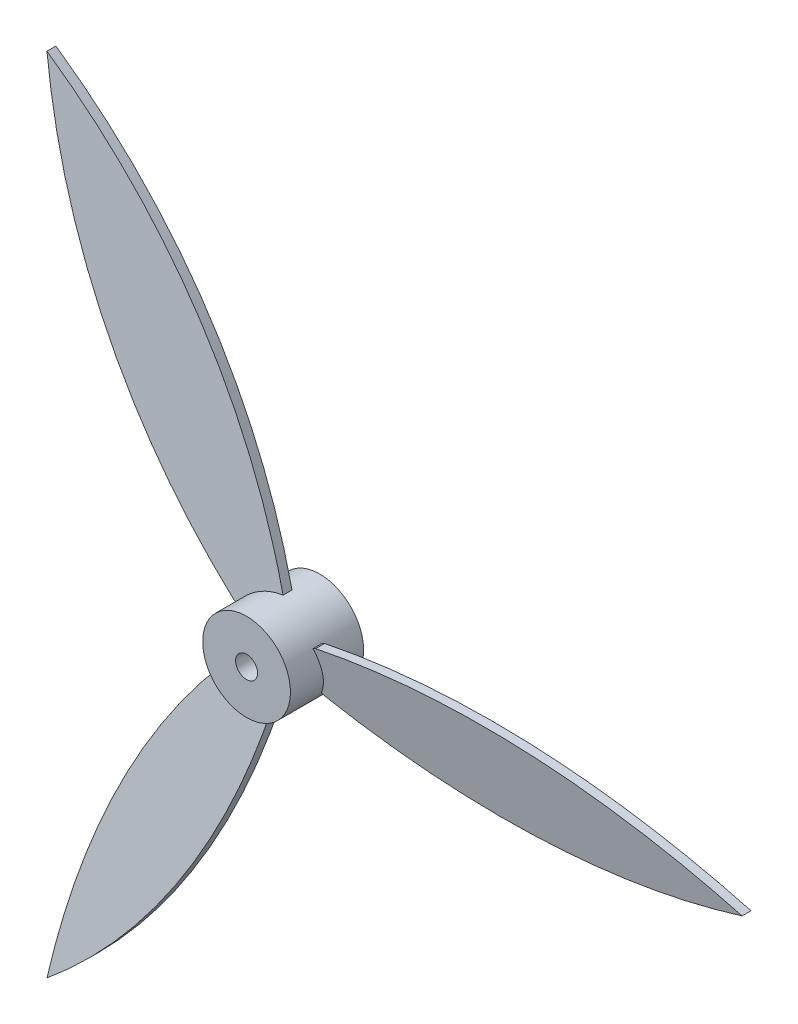
ISO-10303-21;
HEADER;
FILE_DESCRIPTION(('STEP AP214'),'2;1');
FILE_NAME('part.step','',(''),(''),'','','');
FILE_SCHEMA(('AUTOMOTIVE_DESIGN { 1 0 10303 214 1 1 1 1 }'));
ENDSEC;
DATA;
#1=APPLICATION_CONTEXT('core data for automotive mechanical design processes');
#2=APPLICATION_PROTOCOL_DEFINITION('international standard','automotive_design',2000,#1);
#3=PRODUCT_CONTEXT('',#1,'mechanical');
#4=PRODUCT('Part','Part','',(#3));
#5=PRODUCT_RELATED_PRODUCT_CATEGORY('part','',(#4));
#6=PRODUCT_DEFINITION_FORMATION('','',#4);
#7=PRODUCT_DEFINITION_CONTEXT('part definition',#1,'design');
#8=PRODUCT_DEFINITION('design','',#6,#7);
#9=PRODUCT_DEFINITION_SHAPE('','',#8);
#10=(LENGTH_UNIT() NAMED_UNIT(*) SI_UNIT(.MILLI.,.METRE.));
#11=(NAMED_UNIT(*) PLANE_ANGLE_UNIT() SI_UNIT($,.RADIAN.));
#12=(NAMED_UNIT(*) SI_UNIT($,.STERADIAN.) SOLID_ANGLE_UNIT());
#13=UNCERTAINTY_MEASURE_WITH_UNIT(LENGTH_MEASURE(1.E-05),#10,'distance_accuracy_value','');
#14=(GEOMETRIC_REPRESENTATION_CONTEXT(3) GLOBAL_UNCERTAINTY_ASSIGNED_CONTEXT((#13)) GLOBAL_UNIT_ASSIGNED_CONTEXT((#10,
#11,#12)) REPRESENTATION_CONTEXT('',''));
#15=CARTESIAN_POINT('',(0.,0.,0.));
#16=DIRECTION('',(0.,0.,1.));
#17=DIRECTION('',(1.,0.,0.));
#18=AXIS2_PLACEMENT_3D('',#15,#16,#17);
#19=CARTESIAN_POINT('',(125.,189.733037880005,0.588348405414554));
#20=DIRECTION('',(0.,0.196116135138184,-0.98058067569092));
#21=DIRECTION('',(0.,0.98058067569092,0.196116135138184));
#22=AXIS2_PLACEMENT_3D('',#19,#20,#21);
#23=PLANE('',#22);
#24=DIRECTION('',(0.861727484432137,0.497518595104998,0.0995037190209998));
#25=VECTOR('',#24,1.);
#26=CARTESIAN_POINT('',(104.024288044242,224.666690603373,7.57507895008811));
#27=LINE('',#26,#25);
#28=CARTESIAN_POINT('',(5.40472110410609,167.72865708312,-3.81252775396237));
#29=VERTEX_POINT('',#28);
#30=CARTESIAN_POINT('',(5.82433817705994,167.970923113147,-3.76407454795708));
#31=VERTEX_POINT('',#30);
#32=EDGE_CURVE('E201',#29,#31,#27,.T.);
#33=ORIENTED_EDGE('',*,*,#32,.F.);
#34=CARTESIAN_POINT('',(0.139988770109136,164.850707561088,-4.38811765836887));
#35=DIRECTION('',(0.,0.196116135138184,-0.98058067569092));
#36=DIRECTION('',(0.,0.98058067569092,0.196116135138184));
#37=AXIS2_PLACEMENT_3D('',#34,#35,#36);
#38=ELLIPSE('',#37,6.11882341631134,6.);
#39=CARTESIAN_POINT('',(5.40472110410611,161.972758039056,-4.96370756277535));
#40=VERTEX_POINT('',#39);
#41=EDGE_CURVE('E210',#40,#29,#38,.F.);
#42=ORIENTED_EDGE('',*,*,#41,.F.);
#43=DIRECTION('',(-0.861727484432144,0.497518595104987,0.0995037190209974));
#44=VECTOR('',#43,1.);
#45=CARTESIAN_POINT('',(81.8354965907787,117.845429237454,-13.7891733230956));
#46=LINE('',#45,#44);
#47=CARTESIAN_POINT('',(5.82433817706023,161.730492009029,-5.01216076878067));
#48=VERTEX_POINT('',#47);
#49=EDGE_CURVE('E379',#48,#40,#46,.T.);
#50=ORIENTED_EDGE('',*,*,#49,.F.);
#51=CARTESIAN_POINT('',(29.4903176371221,258.889750014614,14.4196908323364));
#52=DIRECTION('',(0.,0.196116135138184,-0.98058067569092));
#53=DIRECTION('',(0.,0.98058067569092,0.196116135138184));
#54=AXIS2_PLACEMENT_3D('',#51,#52,#53);
#55=ELLIPSE('',#54,101.980390271856,100.);
#56=CARTESIAN_POINT('',(63.5,164.850707561088,-4.38811765836887));
#57=VERTEX_POINT('',#56);
#58=EDGE_CURVE('E333',#57,#48,#55,.T.);
#59=ORIENTED_EDGE('',*,*,#58,.F.);
#60=CARTESIAN_POINT('',(29.4903176371221,70.8116651075614,-23.1959261490742));
#61=DIRECTION('',(0.,0.196116135138184,-0.98058067569092));
#62=DIRECTION('',(0.,0.98058067569092,0.196116135138184));
#63=AXIS2_PLACEMENT_3D('',#60,#61,#62);
#64=ELLIPSE('',#63,101.980390271856,100.);
#65=EDGE_CURVE('E330',#57,#31,#64,.F.);
#66=ORIENTED_EDGE('',*,*,#65,.T.);
#67=EDGE_LOOP('',(#33,#42,#50,#59,#66));
#68=FACE_BOUND('',#67,.T.);
#69=ADVANCED_FACE('F34',(#68),#23,.F.);
#70=CARTESIAN_POINT('',(125.,189.968377242171,-0.58834840541455));
#71=DIRECTION('',(0.,-0.196116135138184,0.98058067569092));
#72=DIRECTION('',(0.,-0.98058067569092,-0.196116135138184));
#73=AXIS2_PLACEMENT_3D('',#70,#71,#72);
#74=PLANE('',#73);
#75=DIRECTION('',(-0.861727484432137,-0.497518595104998,-0.0995037190209997));
#76=VECTOR('',#75,1.);
#77=CARTESIAN_POINT('',(104.129219856515,224.727273013435,6.36343074883834));
#78=LINE('',#77,#76);
#79=CARTESIAN_POINT('',(5.82433817705994,167.970923113147,-4.98783923121934));
#80=VERTEX_POINT('',#79);
#81=CARTESIAN_POINT('',(5.40472110410609,167.72865708312,-5.03629243722464));
#82=VERTEX_POINT('',#81);
#83=EDGE_CURVE('E190',#80,#82,#78,.T.);
#84=ORIENTED_EDGE('',*,*,#83,.F.);
#85=CARTESIAN_POINT('',(29.4903176371221,70.8116651075614,-24.4196908323364));
#86=DIRECTION('',(0.,-0.196116135138184,0.98058067569092));
#87=DIRECTION('',(0.,0.98058067569092,0.196116135138184));
#88=AXIS2_PLACEMENT_3D('',#85,#86,#87);
#89=ELLIPSE('',#88,101.980390271856,100.);
#90=CARTESIAN_POINT('',(63.5,164.850707561088,-5.61188234163113));
#91=VERTEX_POINT('',#90);
#92=EDGE_CURVE('E251',#80,#91,#89,.F.);
#93=ORIENTED_EDGE('',*,*,#92,.T.);
#94=CARTESIAN_POINT('',(29.4903176371221,258.889750014614,13.1959261490742));
#95=DIRECTION('',(0.,-0.196116135138184,0.98058067569092));
#96=DIRECTION('',(0.,0.98058067569092,0.196116135138184));
#97=AXIS2_PLACEMENT_3D('',#94,#95,#96);
#98=ELLIPSE('',#97,101.980390271856,100.);
#99=CARTESIAN_POINT('',(5.82433817706023,161.730492009029,-6.23592545204293));
#100=VERTEX_POINT('',#99);
#101=EDGE_CURVE('E254',#100,#91,#98,.T.);
#102=ORIENTED_EDGE('',*,*,#101,.F.);
#103=DIRECTION('',(0.861727484432144,-0.497518595104987,-0.0995037190209974));
#104=VECTOR('',#103,1.);
#105=CARTESIAN_POINT('',(81.7305647785056,117.906011647517,-15.0008215243454));
#106=LINE('',#105,#104);
#107=CARTESIAN_POINT('',(5.40472110410611,161.972758039056,-6.18747224603761));
#108=VERTEX_POINT('',#107);
#109=EDGE_CURVE('E217',#108,#100,#106,.T.);
#110=ORIENTED_EDGE('',*,*,#109,.F.);
#111=CARTESIAN_POINT('',(0.139988770109136,164.850707561088,-5.61188234163113));
#112=DIRECTION('',(0.,-0.196116135138184,0.98058067569092));
#113=DIRECTION('',(0.,0.98058067569092,0.196116135138184));
#114=AXIS2_PLACEMENT_3D('',#111,#112,#113);
#115=ELLIPSE('',#114,6.11882341631134,6.);
#116=EDGE_CURVE('E208',#82,#108,#115,.F.);
#117=ORIENTED_EDGE('',*,*,#116,.F.);
#118=EDGE_LOOP('',(#84,#93,#102,#110,#117));
#119=FACE_BOUND('',#118,.T.);
#120=ADVANCED_FACE('F215',(#119),#74,.F.);
#121=CARTESIAN_POINT('',(29.4903176371221,258.889750014614,-10.5883484054145));
#122=DIRECTION('',(0.,0.,1.));
#123=DIRECTION('',(1.,0.,0.));
#124=AXIS2_PLACEMENT_3D('',#121,#122,#123);
#125=CYLINDRICAL_SURFACE('',#124,100.);
#126=ORIENTED_EDGE('',*,*,#58,.T.);
#127=DIRECTION('',(0.,0.,1.));
#128=VECTOR('',#127,1.);
#129=CARTESIAN_POINT('',(5.82433817706023,161.730492009029,-10.5883484054145));
#130=LINE('',#129,#128);
#131=EDGE_CURVE('E383',#48,#100,#130,.F.);
#132=ORIENTED_EDGE('',*,*,#131,.T.);
#133=ORIENTED_EDGE('',*,*,#101,.T.);
#134=DIRECTION('',(0.,0.,1.));
#135=VECTOR('',#134,1.);
#136=CARTESIAN_POINT('',(63.5,164.850707561088,-10.5883484054145));
#137=LINE('',#136,#135);
#138=EDGE_CURVE('E327',#91,#57,#137,.T.);
#139=ORIENTED_EDGE('',*,*,#138,.T.);
#140=EDGE_LOOP('',(#126,#132,#133,#139));
#141=FACE_BOUND('',#140,.T.);
#142=ADVANCED_FACE('F582',(#141),#125,.T.);
#143=CARTESIAN_POINT('',(29.4903176371221,70.8116651075614,-10.5883484054145));
#144=DIRECTION('',(0.,0.,1.));
#145=DIRECTION('',(1.,0.,0.));
#146=AXIS2_PLACEMENT_3D('',#143,#144,#145);
#147=CYLINDRICAL_SURFACE('',#146,100.);
#148=DIRECTION('',(0.,0.,1.));
#149=VECTOR('',#148,1.);
#150=CARTESIAN_POINT('',(5.82433817705994,167.970923113147,-10.5883484054145));
#151=LINE('',#150,#149);
#152=EDGE_CURVE('E196',#31,#80,#151,.F.);
#153=ORIENTED_EDGE('',*,*,#152,.F.);
#154=ORIENTED_EDGE('',*,*,#65,.F.);
#155=ORIENTED_EDGE('',*,*,#138,.F.);
#156=ORIENTED_EDGE('',*,*,#92,.F.);
#157=EDGE_LOOP('',(#153,#154,#155,#156));
#158=FACE_BOUND('',#157,.T.);
#159=ADVANCED_FACE('F450',(#158),#147,.T.);
#160=CARTESIAN_POINT('',(-40.5374768171512,44.1599310786503,-0.58834840541455));
#161=DIRECTION('',(-0.16984155512169,0.0980580675690905,0.98058067569092));
#162=DIRECTION('',(0.985329278164293,0.,0.170664037196573));
#163=AXIS2_PLACEMENT_3D('',#160,#161,#162);
#164=PLANE('',#163);
#165=DIRECTION('',(-0.861727484432137,-0.497518595104998,-0.0995037190209997));
#166=VECTOR('',#165,1.);
#167=CARTESIAN_POINT('',(-81.3105984681764,117.663543985198,-15.0008215243455));
#168=LINE('',#167,#166);
#169=CARTESIAN_POINT('',(-4.98475479377872,161.730290376737,-6.18747224603762));
#170=VERTEX_POINT('',#169);
#171=CARTESIAN_POINT('',(-5.40437186673265,161.488024346711,-6.23592545204292));
#172=VERTEX_POINT('',#171);
#173=EDGE_CURVE('E393',#170,#172,#168,.T.);
#174=ORIENTED_EDGE('',*,*,#173,.F.);
#175=CARTESIAN_POINT('',(0.139988770109136,164.850707561088,-5.61188234163113));
#176=DIRECTION('',(-0.16984155512169,0.0980580675690905,0.98058067569092));
#177=DIRECTION('',(0.849207775608451,-0.490290337845452,0.196116135138184));
#178=AXIS2_PLACEMENT_3D('',#175,#176,#177);
#179=ELLIPSE('',#178,6.11882341631134,6.);
#180=CARTESIAN_POINT('',(0.139988770109178,158.850707561088,-5.01188234163113));
#181=VERTEX_POINT('',#180);
#182=EDGE_CURVE('E320',#181,#170,#179,.F.);
#183=ORIENTED_EDGE('',*,*,#182,.F.);
#184=CARTESIAN_POINT('',(-95.9753753757148,186.452098379589,-24.4196908323364));
#185=DIRECTION('',(-0.16984155512169,0.0980580675690905,0.98058067569092));
#186=DIRECTION('',(0.849207775608451,-0.490290337845452,0.196116135138184));
#187=AXIS2_PLACEMENT_3D('',#184,#185,#186);
#188=ELLIPSE('',#187,101.980390271856,100.);
#189=CARTESIAN_POINT('',(-31.5400168448358,109.979328251935,-5.61188234163113));
#190=VERTEX_POINT('',#189);
#191=EDGE_CURVE('E386',#181,#190,#188,.F.);
#192=ORIENTED_EDGE('',*,*,#191,.T.);
#193=CARTESIAN_POINT('',(66.9050240489205,92.4130559260643,13.1959261490742));
#194=DIRECTION('',(-0.16984155512169,0.0980580675690905,0.98058067569092));
#195=DIRECTION('',(0.849207775608451,-0.490290337845452,0.196116135138184));
#196=AXIS2_PLACEMENT_3D('',#193,#194,#195);
#197=ELLIPSE('',#196,101.980390271856,100.);
#198=EDGE_CURVE('E402',#172,#190,#197,.T.);
#199=ORIENTED_EDGE('',*,*,#198,.F.);
#200=EDGE_LOOP('',(#174,#183,#192,#199));
#201=FACE_BOUND('',#200,.T.);
#202=ADVANCED_FACE('F444',(#201),#164,.F.);
#203=CARTESIAN_POINT('',(-40.7412866832972,44.2776007597332,0.588348405414554));
#204=DIRECTION('',(0.16984155512169,-0.0980580675690905,-0.98058067569092));
#205=DIRECTION('',(-0.985329278164293,0.,-0.170664037196573));
#206=AXIS2_PLACEMENT_3D('',#203,#204,#205);
#207=PLANE('',#206);
#208=DIRECTION('',(0.861727484432137,0.497518595104999,0.0995037190209998));
#209=VECTOR('',#208,1.);
#210=CARTESIAN_POINT('',(-81.4155302804496,117.602961575136,-13.7891733230957));
#211=LINE('',#210,#209);
#212=CARTESIAN_POINT('',(-5.40437186673265,161.488024346711,-5.01216076878066));
#213=VERTEX_POINT('',#212);
#214=CARTESIAN_POINT('',(-4.98475479377872,161.730290376737,-4.96370756277536));
#215=VERTEX_POINT('',#214);
#216=EDGE_CURVE('E395',#213,#215,#211,.T.);
#217=ORIENTED_EDGE('',*,*,#216,.F.);
#218=CARTESIAN_POINT('',(66.9050240489205,92.4130559260643,14.4196908323364));
#219=DIRECTION('',(0.16984155512169,-0.0980580675690905,-0.98058067569092));
#220=DIRECTION('',(0.849207775608451,-0.490290337845452,0.196116135138184));
#221=AXIS2_PLACEMENT_3D('',#218,#219,#220);
#222=ELLIPSE('',#221,101.980390271856,100.);
#223=CARTESIAN_POINT('',(-31.5400168448358,109.979328251935,-4.38811765836886));
#224=VERTEX_POINT('',#223);
#225=EDGE_CURVE('E405',#224,#213,#222,.T.);
#226=ORIENTED_EDGE('',*,*,#225,.F.);
#227=CARTESIAN_POINT('',(-95.9753753757148,186.452098379589,-23.1959261490742));
#228=DIRECTION('',(0.16984155512169,-0.0980580675690905,-0.98058067569092));
#229=DIRECTION('',(0.849207775608451,-0.490290337845452,0.196116135138184));
#230=AXIS2_PLACEMENT_3D('',#227,#228,#229);
#231=ELLIPSE('',#230,101.980390271856,100.);
#232=CARTESIAN_POINT('',(0.139988770109178,158.850707561088,-3.78811765836886));
#233=VERTEX_POINT('',#232);
#234=EDGE_CURVE('E11',#224,#233,#231,.F.);
#235=ORIENTED_EDGE('',*,*,#234,.T.);
#236=CARTESIAN_POINT('',(0.139988770109136,164.850707561088,-4.38811765836886));
#237=DIRECTION('',(0.16984155512169,-0.0980580675690905,-0.98058067569092));
#238=DIRECTION('',(0.849207775608451,-0.490290337845452,0.196116135138184));
#239=AXIS2_PLACEMENT_3D('',#236,#237,#238);
#240=ELLIPSE('',#239,6.11882341631134,6.);
#241=EDGE_CURVE('E348',#215,#233,#240,.F.);
#242=ORIENTED_EDGE('',*,*,#241,.F.);
#243=EDGE_LOOP('',(#217,#226,#235,#242));
#244=FACE_BOUND('',#243,.T.);
#245=ADVANCED_FACE('F449',(#244),#207,.F.);
#246=CARTESIAN_POINT('',(-84.0425568725207,260.423814362442,-0.58834840541455));
#247=DIRECTION('',(0.169841555121689,0.0980580675690928,0.98058067569092));
#248=DIRECTION('',(0.985329278164293,0.,-0.170664037196572));
#249=AXIS2_PLACEMENT_3D('',#246,#247,#248);
#250=PLANE('',#249);
#251=CARTESIAN_POINT('',(-95.9753753757145,143.249316742585,13.1959261490742));
#252=DIRECTION('',(0.169841555121689,0.0980580675690928,0.98058067569092));
#253=DIRECTION('',(-0.849207775608445,-0.490290337845464,0.196116135138184));
#254=AXIS2_PLACEMENT_3D('',#251,#252,#253);
#255=ELLIPSE('',#254,101.980390271856,100.);
#256=CARTESIAN_POINT('',(0.139988770109095,170.850707561088,-6.21188234163113));
#257=VERTEX_POINT('',#256);
#258=CARTESIAN_POINT('',(-31.5400168448366,219.722086870241,-5.61188234163113));
#259=VERTEX_POINT('',#258);
#260=EDGE_CURVE('E397',#257,#259,#255,.T.);
#261=ORIENTED_EDGE('',*,*,#260,.F.);
#262=CARTESIAN_POINT('',(0.139988770109136,164.850707561088,-5.61188234163113));
#263=DIRECTION('',(0.169841555121689,0.0980580675690928,0.98058067569092));
#264=DIRECTION('',(-0.849207775608445,-0.490290337845464,0.196116135138184));
#265=AXIS2_PLACEMENT_3D('',#262,#263,#264);
#266=ELLIPSE('',#265,6.11882341631134,6.);
#267=CARTESIAN_POINT('',(-4.98475479377876,167.971124745438,-5.03629243722463));
#268=VERTEX_POINT('',#267);
#269=EDGE_CURVE('E303',#268,#257,#266,.F.);
#270=ORIENTED_EDGE('',*,*,#269,.F.);
#271=DIRECTION('',(0.861727484432144,-0.497518595104987,-0.0995037190209997));
#272=VECTOR('',#271,1.);
#273=CARTESIAN_POINT('',(-103.709253546189,224.969740675752,6.36343074883834));
#274=LINE('',#273,#272);
#275=CARTESIAN_POINT('',(-5.40437186673261,168.213390775465,-4.98783923121934));
#276=VERTEX_POINT('',#275);
#277=EDGE_CURVE('E400',#276,#268,#274,.T.);
#278=ORIENTED_EDGE('',*,*,#277,.F.);
#279=CARTESIAN_POINT('',(66.9050240489195,237.288359196112,-24.4196908323364));
#280=DIRECTION('',(0.169841555121689,0.0980580675690928,0.98058067569092));
#281=DIRECTION('',(-0.849207775608445,-0.490290337845464,0.196116135138184));
#282=AXIS2_PLACEMENT_3D('',#279,#280,#281);
#283=ELLIPSE('',#282,101.980390271856,100.);
#284=EDGE_CURVE('E389',#276,#259,#283,.F.);
#285=ORIENTED_EDGE('',*,*,#284,.T.);
#286=EDGE_LOOP('',(#261,#270,#278,#285));
#287=FACE_BOUND('',#286,.T.);
#288=ADVANCED_FACE('F434',(#287),#250,.F.);
#289=CARTESIAN_POINT('',(-83.8387470063747,260.541484043525,0.588348405414554));
#290=DIRECTION('',(-0.169841555121689,-0.0980580675690929,-0.98058067569092));
#291=DIRECTION('',(-0.985329278164293,0.,0.170664037196572));
#292=AXIS2_PLACEMENT_3D('',#289,#290,#291);
#293=PLANE('',#292);
#294=CARTESIAN_POINT('',(-95.9753753757145,143.249316742585,14.4196908323364));
#295=DIRECTION('',(-0.169841555121689,-0.0980580675690929,-0.98058067569092));
#296=DIRECTION('',(-0.849207775608444,-0.490290337845464,0.196116135138184));
#297=AXIS2_PLACEMENT_3D('',#294,#295,#296);
#298=ELLIPSE('',#297,101.980390271856,100.);
#299=CARTESIAN_POINT('',(-31.5400168448366,219.722086870241,-4.38811765836886));
#300=VERTEX_POINT('',#299);
#301=CARTESIAN_POINT('',(0.139988770109095,170.850707561088,-4.98811765836886));
#302=VERTEX_POINT('',#301);
#303=EDGE_CURVE('E43',#300,#302,#298,.T.);
#304=ORIENTED_EDGE('',*,*,#303,.F.);
#305=CARTESIAN_POINT('',(66.9050240489195,237.288359196112,-23.1959261490742));
#306=DIRECTION('',(-0.169841555121689,-0.0980580675690929,-0.98058067569092));
#307=DIRECTION('',(-0.849207775608444,-0.490290337845464,0.196116135138184));
#308=AXIS2_PLACEMENT_3D('',#305,#306,#307);
#309=ELLIPSE('',#308,101.980390271856,100.);
#310=CARTESIAN_POINT('',(-5.4043718667326,168.213390775465,-3.76407454795708));
#311=VERTEX_POINT('',#310);
#312=EDGE_CURVE('E279',#300,#311,#309,.F.);
#313=ORIENTED_EDGE('',*,*,#312,.T.);
#314=DIRECTION('',(-0.861727484432144,0.497518595104987,0.0995037190209997));
#315=VECTOR('',#314,1.);
#316=CARTESIAN_POINT('',(-103.604321733915,224.909158265689,7.57507895008811));
#317=LINE('',#316,#315);
#318=CARTESIAN_POINT('',(-4.98475479377876,167.971124745438,-3.81252775396237));
#319=VERTEX_POINT('',#318);
#320=EDGE_CURVE('E277',#319,#311,#317,.T.);
#321=ORIENTED_EDGE('',*,*,#320,.F.);
#322=CARTESIAN_POINT('',(0.139988770109136,164.850707561088,-4.38811765836886));
#323=DIRECTION('',(-0.169841555121689,-0.0980580675690929,-0.98058067569092));
#324=DIRECTION('',(-0.849207775608444,-0.490290337845464,0.196116135138184));
#325=AXIS2_PLACEMENT_3D('',#322,#323,#324);
#326=ELLIPSE('',#325,6.11882341631134,6.);
#327=EDGE_CURVE('E301',#302,#319,#326,.F.);
#328=ORIENTED_EDGE('',*,*,#327,.F.);
#329=EDGE_LOOP('',(#304,#313,#321,#328));
#330=FACE_BOUND('',#329,.T.);
#331=ADVANCED_FACE('F307',(#330),#293,.F.);
#332=CARTESIAN_POINT('',(0.139988770109136,164.850707561088,-10.));
#333=DIRECTION('',(0.,0.,1.));
#334=DIRECTION('',(1.,0.,0.));
#335=AXIS2_PLACEMENT_3D('',#332,#333,#334);
#336=CYLINDRICAL_SURFACE('',#335,1.49999999999999);
#337=CARTESIAN_POINT('',(0.139988770109136,164.850707561088,0.));
#338=DIRECTION('',(0.,0.,1.));
#339=DIRECTION('',(1.,0.,0.));
#340=AXIS2_PLACEMENT_3D('',#337,#338,#339);
#341=CIRCLE('',#340,1.49999999999999);
#342=CARTESIAN_POINT('',(1.63998877010913,164.850707561088,0.));
#343=VERTEX_POINT('',#342);
#344=EDGE_CURVE('E220',#343,#343,#341,.T.);
#345=ORIENTED_EDGE('',*,*,#344,.T.);
#346=EDGE_LOOP('',(#345));
#347=FACE_BOUND('',#346,.T.);
#348=CARTESIAN_POINT('',(0.139988770109136,164.850707561088,-4.38811765836886));
#349=DIRECTION('',(-0.169841555121689,-0.0980580675690929,-0.98058067569092));
#350=DIRECTION('',(-0.849207775608444,-0.490290337845464,0.196116135138184));
#351=AXIS2_PLACEMENT_3D('',#348,#349,#350);
#352=ELLIPSE('',#351,1.52970585407783,1.49999999999999);
#353=CARTESIAN_POINT('',(0.,166.344160989971,-4.51321623502538));
#354=VERTEX_POINT('',#353);
#355=CARTESIAN_POINT('',(-1.08338545361822,163.982747015487,-4.0894269725922));
#356=VERTEX_POINT('',#355);
#357=EDGE_CURVE('E309',#354,#356,#352,.F.);
#358=ORIENTED_EDGE('',*,*,#357,.F.);
#359=DIRECTION('',(0.,0.,1.));
#360=VECTOR('',#359,1.);
#361=CARTESIAN_POINT('',(0.,166.344160989971,-10.));
#362=LINE('',#361,#360);
#363=CARTESIAN_POINT('',(0.,166.344160989971,-4.08942697259221));
#364=VERTEX_POINT('',#363);
#365=EDGE_CURVE('E237',#354,#364,#362,.T.);
#366=ORIENTED_EDGE('',*,*,#365,.T.);
#367=CARTESIAN_POINT('',(0.139988770109136,164.850707561088,-4.38811765836887));
#368=DIRECTION('',(0.,0.196116135138184,-0.98058067569092));
#369=DIRECTION('',(0.,0.98058067569092,0.196116135138184));
#370=AXIS2_PLACEMENT_3D('',#367,#368,#369);
#371=ELLIPSE('',#370,1.52970585407783,1.49999999999999);
#372=CARTESIAN_POINT('',(1.50335176394563,164.225214677805,-4.51321623502538));
#373=VERTEX_POINT('',#372);
#374=EDGE_CURVE('E245',#373,#364,#371,.F.);
#375=ORIENTED_EDGE('',*,*,#374,.F.);
#376=DIRECTION('',(0.,0.,1.));
#377=VECTOR('',#376,1.);
#378=CARTESIAN_POINT('',(1.50335176394563,164.225214677805,-10.));
#379=LINE('',#378,#377);
#380=CARTESIAN_POINT('',(1.50335176394563,164.225214677805,-4.0894269725922));
#381=VERTEX_POINT('',#380);
#382=EDGE_CURVE('E354',#373,#381,#379,.T.);
#383=ORIENTED_EDGE('',*,*,#382,.T.);
#384=CARTESIAN_POINT('',(0.139988770109136,164.850707561088,-4.38811765836886));
#385=DIRECTION('',(0.16984155512169,-0.0980580675690905,-0.98058067569092));
#386=DIRECTION('',(0.849207775608451,-0.490290337845452,0.196116135138184));
#387=AXIS2_PLACEMENT_3D('',#384,#385,#386);
#388=ELLIPSE('',#387,1.52970585407783,1.49999999999999);
#389=CARTESIAN_POINT('',(-1.08338545361819,163.982747015487,-4.51321623502538));
#390=VERTEX_POINT('',#389);
#391=EDGE_CURVE('E350',#390,#381,#388,.F.);
#392=ORIENTED_EDGE('',*,*,#391,.F.);
#393=DIRECTION('',(0.,0.,1.));
#394=VECTOR('',#393,1.);
#395=CARTESIAN_POINT('',(-1.08338545361822,163.982747015487,-10.));
#396=LINE('',#395,#394);
#397=EDGE_CURVE('E272',#390,#356,#396,.T.);
#398=ORIENTED_EDGE('',*,*,#397,.T.);
#399=EDGE_LOOP('',(#358,#366,#375,#383,#392,#398));
#400=FACE_BOUND('',#399,.T.);
#401=ADVANCED_FACE('F433',(#347,#400),#336,.F.);
#402=CARTESIAN_POINT('',(0.,0.,0.));
#403=DIRECTION('',(-1.,0.,0.));
#404=DIRECTION('',(0.,0.,1.));
#405=AXIS2_PLACEMENT_3D('',#402,#403,#404);
#406=PLANE('',#405);
#407=ORIENTED_EDGE('',*,*,#365,.F.);
#408=DIRECTION('',(0.,-0.995037190209989,0.0995037190209997));
#409=VECTOR('',#408,1.);
#410=CARTESIAN_POINT('',(0.,1.20011879841307,12.0011879841306));
#411=LINE('',#410,#409);
#412=CARTESIAN_POINT('',(0.,164.931530115194,-4.37195314754766));
#413=VERTEX_POINT('',#412);
#414=EDGE_CURVE('E314',#354,#413,#411,.T.);
#415=ORIENTED_EDGE('',*,*,#414,.T.);
#416=DIRECTION('',(0.,-0.98058067569092,-0.196116135138184));
#417=VECTOR('',#416,1.);
#418=CARTESIAN_POINT('',(0.,189.733037880005,0.588348405414554));
#419=LINE('',#418,#417);
#420=EDGE_CURVE('E222',#364,#413,#419,.T.);
#421=ORIENTED_EDGE('',*,*,#420,.F.);
#422=EDGE_LOOP('',(#407,#415,#421));
#423=FACE_BOUND('',#422,.T.);
#424=ADVANCED_FACE('F345',(#423),#406,.T.);
#425=DIRECTION('',(0.,0.,1.));
#426=VECTOR('',#425,1.);
#427=CARTESIAN_POINT('',(0.,163.357254132205,-10.));
#428=LINE('',#427,#426);
#429=CARTESIAN_POINT('',(0.,163.357254132205,-5.48678376497461));
#430=VERTEX_POINT('',#429);
#431=CARTESIAN_POINT('',(0.,163.357254132205,-5.91057302740779));
#432=VERTEX_POINT('',#431);
#433=EDGE_CURVE('E249',#430,#432,#428,.F.);
#434=ORIENTED_EDGE('',*,*,#433,.F.);
#435=DIRECTION('',(0.,0.995037190209989,-0.0995037190209973));
#436=VECTOR('',#435,1.);
#437=CARTESIAN_POINT('',(0.,1.07415263844014,10.7415263844016));
#438=LINE('',#437,#436);
#439=CARTESIAN_POINT('',(0.,164.769885006982,-5.62804685245233));
#440=VERTEX_POINT('',#439);
#441=EDGE_CURVE('E308',#430,#440,#438,.T.);
#442=ORIENTED_EDGE('',*,*,#441,.T.);
#443=DIRECTION('',(0.,0.98058067569092,0.196116135138184));
#444=VECTOR('',#443,1.);
#445=CARTESIAN_POINT('',(0.,189.968377242171,-0.58834840541455));
#446=LINE('',#445,#444);
#447=EDGE_CURVE('E218',#432,#440,#446,.T.);
#448=ORIENTED_EDGE('',*,*,#447,.F.);
#449=EDGE_LOOP('',(#434,#442,#448));
#450=FACE_BOUND('',#449,.T.);
#451=ADVANCED_FACE('F598',(#450),#406,.T.);
#452=DIRECTION('',(-0.86172748443214,0.497518595104993,0.0995037190209985));
#453=VECTOR('',#452,1.);
#454=CARTESIAN_POINT('',(81.7634231645831,117.725395741257,-13.8131800223351));
#455=LINE('',#454,#453);
#456=CARTESIAN_POINT('',(0.139988770109151,164.850707561088,-4.38811765836887));
#457=VERTEX_POINT('',#456);
#458=EDGE_CURVE('E261',#457,#413,#455,.T.);
#459=ORIENTED_EDGE('',*,*,#458,.F.);
#460=DIRECTION('',(-0.861727484432137,-0.497518595104999,-0.0995037190209998));
#461=VECTOR('',#460,1.);
#462=CARTESIAN_POINT('',(103.952214618047,224.78672409957,7.59908564932752));
#463=LINE('',#462,#461);
#464=CARTESIAN_POINT('',(0.279977540218314,164.931530115194,-4.37195314754766));
#465=VERTEX_POINT('',#464);
#466=EDGE_CURVE('E259',#465,#457,#463,.T.);
#467=ORIENTED_EDGE('',*,*,#466,.F.);
#468=DIRECTION('',(0.861727484432144,-0.497518595104987,-0.0995037190209974));
#469=VECTOR('',#468,1.);
#470=CARTESIAN_POINT('',(81.8354965907787,117.845429237454,-13.7891733230956));
#471=LINE('',#470,#469);
#472=EDGE_CURVE('E256',#465,#373,#471,.T.);
#473=ORIENTED_EDGE('',*,*,#472,.T.);
#474=ORIENTED_EDGE('',*,*,#374,.T.);
#475=ORIENTED_EDGE('',*,*,#420,.T.);
#476=EDGE_LOOP('',(#459,#467,#473,#474,#475));
#477=FACE_BOUND('',#476,.T.);
#478=ADVANCED_FACE('F339',(#477),#23,.F.);
#479=CARTESIAN_POINT('',(0.139988770109136,164.850707561088,-10.));
#480=DIRECTION('',(0.,0.,1.));
#481=DIRECTION('',(1.,0.,0.));
#482=AXIS2_PLACEMENT_3D('',#479,#480,#481);
#483=CYLINDRICAL_SURFACE('',#482,6.);
#484=ORIENTED_EDGE('',*,*,#41,.T.);
#485=DIRECTION('',(0.,0.,1.));
#486=VECTOR('',#485,1.);
#487=CARTESIAN_POINT('',(5.40472110410609,167.72865708312,-10.5883484054145));
#488=LINE('',#487,#486);
#489=EDGE_CURVE('E193',#82,#29,#488,.T.);
#490=ORIENTED_EDGE('',*,*,#489,.F.);
#491=ORIENTED_EDGE('',*,*,#116,.T.);
#492=DIRECTION('',(0.,0.,1.));
#493=VECTOR('',#492,1.);
#494=CARTESIAN_POINT('',(5.40472110410611,161.972758039056,-10.5883484054145));
#495=LINE('',#494,#493);
#496=EDGE_CURVE('E421',#108,#40,#495,.T.);
#497=ORIENTED_EDGE('',*,*,#496,.T.);
#498=EDGE_LOOP('',(#484,#490,#491,#497));
#499=FACE_BOUND('',#498,.T.);
#500=DIRECTION('',(0.,0.,1.));
#501=VECTOR('',#500,1.);
#502=CARTESIAN_POINT('',(-4.98475479377872,161.730290376737,-10.5883484054145));
#503=LINE('',#502,#501);
#504=EDGE_CURVE('E211',#170,#215,#503,.T.);
#505=ORIENTED_EDGE('',*,*,#504,.T.);
#506=ORIENTED_EDGE('',*,*,#241,.T.);
#507=DIRECTION('',(0.,0.,1.));
#508=VECTOR('',#507,1.);
#509=CARTESIAN_POINT('',(0.139988770109178,158.850707561088,-10.5883484054145));
#510=LINE('',#509,#508);
#511=EDGE_CURVE('E423',#181,#233,#510,.T.);
#512=ORIENTED_EDGE('',*,*,#511,.F.);
#513=ORIENTED_EDGE('',*,*,#182,.T.);
#514=EDGE_LOOP('',(#505,#506,#512,#513));
#515=FACE_BOUND('',#514,.T.);
#516=CARTESIAN_POINT('',(0.139988770109136,164.850707561088,-10.));
#517=DIRECTION('',(0.,0.,1.));
#518=DIRECTION('',(1.,0.,0.));
#519=AXIS2_PLACEMENT_3D('',#516,#517,#518);
#520=CIRCLE('',#519,6.);
#521=CARTESIAN_POINT('',(6.13998877010914,164.850707561088,-10.));
#522=VERTEX_POINT('',#521);
#523=EDGE_CURVE('E233',#522,#522,#520,.T.);
#524=ORIENTED_EDGE('',*,*,#523,.T.);
#525=EDGE_LOOP('',(#524));
#526=FACE_BOUND('',#525,.T.);
#527=DIRECTION('',(0.,0.,1.));
#528=VECTOR('',#527,1.);
#529=CARTESIAN_POINT('',(0.139988770109095,170.850707561088,-10.5883484054145));
#530=LINE('',#529,#528);
#531=EDGE_CURVE('E212',#257,#302,#530,.T.);
#532=ORIENTED_EDGE('',*,*,#531,.T.);
#533=ORIENTED_EDGE('',*,*,#327,.T.);
#534=DIRECTION('',(0.,0.,1.));
#535=VECTOR('',#534,1.);
#536=CARTESIAN_POINT('',(-4.98475479377874,167.971124745438,-10.5883484054145));
#537=LINE('',#536,#535);
#538=EDGE_CURVE('E419',#268,#319,#537,.T.);
#539=ORIENTED_EDGE('',*,*,#538,.F.);
#540=ORIENTED_EDGE('',*,*,#269,.T.);
#541=EDGE_LOOP('',(#532,#533,#539,#540));
#542=FACE_BOUND('',#541,.T.);
#543=CARTESIAN_POINT('',(0.139988770109136,164.850707561088,0.));
#544=DIRECTION('',(0.,0.,1.));
#545=DIRECTION('',(1.,0.,0.));
#546=AXIS2_PLACEMENT_3D('',#543,#544,#545);
#547=CIRCLE('',#546,6.);
#548=CARTESIAN_POINT('',(6.13998877010914,164.850707561088,0.));
#549=VERTEX_POINT('',#548);
#550=EDGE_CURVE('E230',#549,#549,#547,.T.);
#551=ORIENTED_EDGE('',*,*,#550,.F.);
#552=EDGE_LOOP('',(#551));
#553=FACE_BOUND('',#552,.T.);
#554=ADVANCED_FACE('F36',(#499,#515,#526,#542,#553),#483,.T.);
#555=CARTESIAN_POINT('',(0.139988770109136,164.850707561088,-10.));
#556=DIRECTION('',(0.,0.,1.));
#557=DIRECTION('',(1.,0.,0.));
#558=AXIS2_PLACEMENT_3D('',#555,#556,#557);
#559=PLANE('',#558);
#560=CARTESIAN_POINT('',(0.139988770109136,164.850707561088,-10.));
#561=DIRECTION('',(0.,0.,1.));
#562=DIRECTION('',(1.,0.,0.));
#563=AXIS2_PLACEMENT_3D('',#560,#561,#562);
#564=CIRCLE('',#563,1.49999999999999);
#565=CARTESIAN_POINT('',(1.63998877010913,164.850707561088,-10.));
#566=VERTEX_POINT('',#565);
#567=EDGE_CURVE('E226',#566,#566,#564,.T.);
#568=ORIENTED_EDGE('',*,*,#567,.T.);
#569=EDGE_LOOP('',(#568));
#570=FACE_BOUND('',#569,.T.);
#571=ORIENTED_EDGE('',*,*,#523,.F.);
#572=EDGE_LOOP('',(#571));
#573=FACE_BOUND('',#572,.T.);
#574=ADVANCED_FACE('F536',(#570,#573),#559,.F.);
#575=CARTESIAN_POINT('',(0.139988770109136,164.850707561088,0.));
#576=DIRECTION('',(0.,0.,1.));
#577=DIRECTION('',(1.,0.,0.));
#578=AXIS2_PLACEMENT_3D('',#575,#576,#577);
#579=PLANE('',#578);
#580=ORIENTED_EDGE('',*,*,#344,.F.);
#581=EDGE_LOOP('',(#580));
#582=FACE_BOUND('',#581,.T.);
#583=ORIENTED_EDGE('',*,*,#550,.T.);
#584=EDGE_LOOP('',(#583));
#585=FACE_BOUND('',#584,.T.);
#586=ADVANCED_FACE('F546',(#582,#585),#579,.T.);
#587=CARTESIAN_POINT('',(0.139988770109136,164.850707561088,-5.61188234163113));
#588=DIRECTION('',(0.,-0.196116135138184,0.98058067569092));
#589=DIRECTION('',(0.,0.98058067569092,0.196116135138184));
#590=AXIS2_PLACEMENT_3D('',#587,#588,#589);
#591=ELLIPSE('',#590,1.52970585407783,1.49999999999999);
#592=CARTESIAN_POINT('',(1.50335176394567,165.476200444371,-5.4867837649746));
#593=VERTEX_POINT('',#592);
#594=EDGE_CURVE('E242',#593,#432,#591,.F.);
#595=ORIENTED_EDGE('',*,*,#594,.F.);
#596=DIRECTION('',(0.,0.,1.));
#597=VECTOR('',#596,1.);
#598=CARTESIAN_POINT('',(1.50335176394562,165.476200444371,-10.));
#599=LINE('',#598,#597);
#600=CARTESIAN_POINT('',(1.50335176394562,165.476200444371,-5.91057302740779));
#601=VERTEX_POINT('',#600);
#602=EDGE_CURVE('E58',#593,#601,#599,.F.);
#603=ORIENTED_EDGE('',*,*,#602,.T.);
#604=CARTESIAN_POINT('',(0.139988770109136,164.850707561088,-5.61188234163113));
#605=DIRECTION('',(0.169841555121689,0.0980580675690928,0.98058067569092));
#606=DIRECTION('',(-0.849207775608445,-0.490290337845464,0.196116135138184));
#607=AXIS2_PLACEMENT_3D('',#604,#605,#606);
#608=ELLIPSE('',#607,1.52970585407783,1.49999999999999);
#609=CARTESIAN_POINT('',(-1.08338545361822,165.718668106689,-5.48678376497461));
#610=VERTEX_POINT('',#609);
#611=EDGE_CURVE('E324',#610,#601,#608,.F.);
#612=ORIENTED_EDGE('',*,*,#611,.F.);
#613=DIRECTION('',(0.,0.,1.));
#614=VECTOR('',#613,1.);
#615=CARTESIAN_POINT('',(-1.08338545361822,165.718668106689,-10.));
#616=LINE('',#615,#614);
#617=CARTESIAN_POINT('',(-1.08338545361822,165.718668106689,-5.91057302740779));
#618=VERTEX_POINT('',#617);
#619=EDGE_CURVE('E275',#610,#618,#616,.F.);
#620=ORIENTED_EDGE('',*,*,#619,.T.);
#621=CARTESIAN_POINT('',(0.139988770109136,164.850707561088,-5.61188234163113));
#622=DIRECTION('',(-0.16984155512169,0.0980580675690905,0.98058067569092));
#623=DIRECTION('',(0.849207775608451,-0.490290337845452,0.196116135138184));
#624=AXIS2_PLACEMENT_3D('',#621,#622,#623);
#625=ELLIPSE('',#624,1.52970585407783,1.49999999999999);
#626=EDGE_CURVE('E312',#430,#618,#625,.F.);
#627=ORIENTED_EDGE('',*,*,#626,.F.);
#628=ORIENTED_EDGE('',*,*,#433,.T.);
#629=EDGE_LOOP('',(#595,#603,#612,#620,#627,#628));
#630=FACE_BOUND('',#629,.T.);
#631=ORIENTED_EDGE('',*,*,#567,.F.);
#632=EDGE_LOOP('',(#631));
#633=FACE_BOUND('',#632,.T.);
#634=ADVANCED_FACE('F556',(#630,#633),#336,.F.);
#635=DIRECTION('',(-0.86172748443214,0.497518595104992,0.0995037190209985));
#636=VECTOR('',#635,1.);
#637=CARTESIAN_POINT('',(81.6584913523099,117.785978151319,-15.0248282235848));
#638=LINE('',#637,#636);
#639=CARTESIAN_POINT('',(0.279977540218235,164.769885006982,-5.62804685245233));
#640=VERTEX_POINT('',#639);
#641=CARTESIAN_POINT('',(0.139988770109148,164.850707561088,-5.61188234163113));
#642=VERTEX_POINT('',#641);
#643=EDGE_CURVE('E266',#640,#642,#638,.T.);
#644=ORIENTED_EDGE('',*,*,#643,.F.);
#645=DIRECTION('',(0.861727484432137,0.497518595104999,0.0995037190209997));
#646=VECTOR('',#645,1.);
#647=CARTESIAN_POINT('',(104.129219856515,224.727273013435,6.36343074883834));
#648=LINE('',#647,#646);
#649=EDGE_CURVE('E269',#640,#593,#648,.T.);
#650=ORIENTED_EDGE('',*,*,#649,.T.);
#651=ORIENTED_EDGE('',*,*,#594,.T.);
#652=ORIENTED_EDGE('',*,*,#447,.T.);
#653=DIRECTION('',(-0.861727484432137,-0.497518595104999,-0.0995037190209997));
#654=VECTOR('',#653,1.);
#655=CARTESIAN_POINT('',(104.05714643032,224.847306509632,6.38743744807775));
#656=LINE('',#655,#654);
#657=EDGE_CURVE('E263',#642,#440,#656,.T.);
#658=ORIENTED_EDGE('',*,*,#657,.F.);
#659=EDGE_LOOP('',(#644,#650,#651,#652,#658));
#660=FACE_BOUND('',#659,.T.);
#661=ADVANCED_FACE('F565',(#660),#74,.F.);
#662=CARTESIAN_POINT('',(-142.554917424579,247.39729517279,0.));
#663=DIRECTION('',(0.499999999999992,0.866025403784443,0.));
#664=DIRECTION('',(0.,0.,1.));
#665=AXIS2_PLACEMENT_3D('',#662,#663,#664);
#666=PLANE('',#665);
#667=ORIENTED_EDGE('',*,*,#382,.F.);
#668=ORIENTED_EDGE('',*,*,#472,.F.);
#669=DIRECTION('',(-0.849207775608451,0.490290337845452,-0.196116135138184));
#670=VECTOR('',#669,1.);
#671=CARTESIAN_POINT('',(21.7587133167018,152.530776232789,0.588348405414554));
#672=LINE('',#671,#670);
#673=EDGE_CURVE('E376',#381,#465,#672,.T.);
#674=ORIENTED_EDGE('',*,*,#673,.F.);
#675=EDGE_LOOP('',(#667,#668,#674));
#676=FACE_BOUND('',#675,.T.);
#677=ADVANCED_FACE('F623',(#676),#666,.T.);
#678=DIRECTION('',(0.861727484432137,0.497518595104999,0.0995037190209998));
#679=VECTOR('',#678,1.);
#680=CARTESIAN_POINT('',(141.93555036792,246.554768111267,12.0011879841306));
#681=LINE('',#680,#679);
#682=CARTESIAN_POINT('',(0.139988770108748,164.689062452876,-4.37195314754763));
#683=VERTEX_POINT('',#682);
#684=EDGE_CURVE('E357',#390,#683,#681,.T.);
#685=ORIENTED_EDGE('',*,*,#684,.F.);
#686=ORIENTED_EDGE('',*,*,#391,.T.);
#687=ORIENTED_EDGE('',*,*,#673,.T.);
#688=ORIENTED_EDGE('',*,*,#466,.T.);
#689=DIRECTION('',(0.,-0.995037190209989,0.0995037190209985));
#690=VECTOR('',#689,1.);
#691=CARTESIAN_POINT('',(0.139988770108498,259.10133120075,-13.8131800223351));
#692=LINE('',#691,#690);
#693=EDGE_CURVE('E365',#457,#683,#692,.T.);
#694=ORIENTED_EDGE('',*,*,#693,.T.);
#695=EDGE_LOOP('',(#685,#686,#687,#688,#694));
#696=FACE_BOUND('',#695,.T.);
#697=ADVANCED_FACE('F465',(#696),#207,.F.);
#698=ORIENTED_EDGE('',*,*,#414,.F.);
#699=ORIENTED_EDGE('',*,*,#357,.T.);
#700=DIRECTION('',(0.849207775608445,0.490290337845464,-0.196116135138184));
#701=VECTOR('',#700,1.);
#702=CARTESIAN_POINT('',(-21.3387470063742,152.28830857047,0.588348405414554));
#703=LINE('',#702,#701);
#704=EDGE_CURVE('E363',#356,#683,#703,.T.);
#705=ORIENTED_EDGE('',*,*,#704,.T.);
#706=ORIENTED_EDGE('',*,*,#693,.F.);
#707=ORIENTED_EDGE('',*,*,#458,.T.);
#708=EDGE_LOOP('',(#698,#699,#705,#706,#707));
#709=FACE_BOUND('',#708,.T.);
#710=ADVANCED_FACE('F436',(#709),#293,.F.);
#711=CARTESIAN_POINT('',(142.974883734905,247.154827510473,0.));
#712=DIRECTION('',(0.500000000000004,-0.866025403784436,0.));
#713=DIRECTION('',(0.,0.,1.));
#714=AXIS2_PLACEMENT_3D('',#711,#712,#713);
#715=PLANE('',#714);
#716=ORIENTED_EDGE('',*,*,#397,.F.);
#717=ORIENTED_EDGE('',*,*,#684,.T.);
#718=ORIENTED_EDGE('',*,*,#704,.F.);
#719=EDGE_LOOP('',(#716,#717,#718));
#720=FACE_BOUND('',#719,.T.);
#721=ADVANCED_FACE('F645',(#720),#715,.T.);
#722=ORIENTED_EDGE('',*,*,#441,.F.);
#723=ORIENTED_EDGE('',*,*,#626,.T.);
#724=DIRECTION('',(0.849207775608451,-0.490290337845452,0.196116135138184));
#725=VECTOR('',#724,1.);
#726=CARTESIAN_POINT('',(21.9625231828478,152.413106551706,-0.58834840541455));
#727=LINE('',#726,#725);
#728=CARTESIAN_POINT('',(0.139988770109054,165.0123526693,-5.62804685245234));
#729=VERTEX_POINT('',#728);
#730=EDGE_CURVE('E374',#618,#729,#727,.T.);
#731=ORIENTED_EDGE('',*,*,#730,.T.);
#732=DIRECTION('',(0.,-0.995037190209989,0.0995037190209985));
#733=VECTOR('',#732,1.);
#734=CARTESIAN_POINT('',(0.139988770108498,258.980166380625,-15.0248282235848));
#735=LINE('',#734,#733);
#736=EDGE_CURVE('E368',#729,#642,#735,.T.);
#737=ORIENTED_EDGE('',*,*,#736,.T.);
#738=ORIENTED_EDGE('',*,*,#657,.T.);
#739=EDGE_LOOP('',(#722,#723,#731,#737,#738));
#740=FACE_BOUND('',#739,.T.);
#741=ADVANCED_FACE('F453',(#740),#164,.F.);
#742=ORIENTED_EDGE('',*,*,#602,.F.);
#743=ORIENTED_EDGE('',*,*,#649,.F.);
#744=DIRECTION('',(-0.849207775608445,-0.490290337845464,0.196116135138184));
#745=VECTOR('',#744,1.);
#746=CARTESIAN_POINT('',(-21.5425568725202,152.170638889387,-0.58834840541455));
#747=LINE('',#746,#745);
#748=EDGE_CURVE('E360',#601,#640,#747,.T.);
#749=ORIENTED_EDGE('',*,*,#748,.F.);
#750=EDGE_LOOP('',(#742,#743,#749));
#751=FACE_BOUND('',#750,.T.);
#752=ADVANCED_FACE('F654',(#751),#715,.T.);
#753=DIRECTION('',(-0.861727484432144,0.497518595104987,0.0995037190209997));
#754=VECTOR('',#753,1.);
#755=CARTESIAN_POINT('',(-103.709253546189,224.969740675752,6.36343074883833));
#756=LINE('',#755,#754);
#757=EDGE_CURVE('E371',#729,#610,#756,.T.);
#758=ORIENTED_EDGE('',*,*,#757,.T.);
#759=ORIENTED_EDGE('',*,*,#611,.T.);
#760=ORIENTED_EDGE('',*,*,#748,.T.);
#761=ORIENTED_EDGE('',*,*,#643,.T.);
#762=ORIENTED_EDGE('',*,*,#736,.F.);
#763=EDGE_LOOP('',(#758,#759,#760,#761,#762));
#764=FACE_BOUND('',#763,.T.);
#765=ADVANCED_FACE('F576',(#764),#250,.F.);
#766=ORIENTED_EDGE('',*,*,#619,.F.);
#767=ORIENTED_EDGE('',*,*,#757,.F.);
#768=ORIENTED_EDGE('',*,*,#730,.F.);
#769=EDGE_LOOP('',(#766,#767,#768));
#770=FACE_BOUND('',#769,.T.);
#771=ADVANCED_FACE('F631',(#770),#666,.T.);
#772=CARTESIAN_POINT('',(-95.9753753757145,143.249316742585,-10.5883484054145));
#773=DIRECTION('',(0.,0.,1.));
#774=DIRECTION('',(1.,0.,0.));
#775=AXIS2_PLACEMENT_3D('',#772,#773,#774);
#776=CYLINDRICAL_SURFACE('',#775,100.);
#777=ORIENTED_EDGE('',*,*,#260,.T.);
#778=DIRECTION('',(0.,0.,1.));
#779=VECTOR('',#778,1.);
#780=CARTESIAN_POINT('',(-31.5400168448366,219.722086870241,-10.5883484054145));
#781=LINE('',#780,#779);
#782=EDGE_CURVE('E293',#259,#300,#781,.T.);
#783=ORIENTED_EDGE('',*,*,#782,.T.);
#784=ORIENTED_EDGE('',*,*,#303,.T.);
#785=ORIENTED_EDGE('',*,*,#531,.F.);
#786=EDGE_LOOP('',(#777,#783,#784,#785));
#787=FACE_BOUND('',#786,.T.);
#788=ADVANCED_FACE('F290',(#787),#776,.T.);
#789=CARTESIAN_POINT('',(-142.554917424579,247.39729517279,-10.5883484054145));
#790=DIRECTION('',(-0.499999999999992,-0.866025403784443,0.));
#791=DIRECTION('',(0.866025403784443,-0.499999999999992,0.));
#792=AXIS2_PLACEMENT_3D('',#789,#790,#791);
#793=PLANE('',#792);
#794=ORIENTED_EDGE('',*,*,#277,.T.);
#795=ORIENTED_EDGE('',*,*,#538,.T.);
#796=ORIENTED_EDGE('',*,*,#320,.T.);
#797=DIRECTION('',(0.,0.,1.));
#798=VECTOR('',#797,1.);
#799=CARTESIAN_POINT('',(-5.4043718667326,168.213390775465,-10.5883484054145));
#800=LINE('',#799,#798);
#801=EDGE_CURVE('E416',#311,#276,#800,.F.);
#802=ORIENTED_EDGE('',*,*,#801,.T.);
#803=EDGE_LOOP('',(#794,#795,#796,#802));
#804=FACE_BOUND('',#803,.T.);
#805=ADVANCED_FACE('F490',(#804),#793,.T.);
#806=CARTESIAN_POINT('',(66.9050240489195,237.288359196112,-10.5883484054145));
#807=DIRECTION('',(0.,0.,1.));
#808=DIRECTION('',(1.,0.,0.));
#809=AXIS2_PLACEMENT_3D('',#806,#807,#808);
#810=CYLINDRICAL_SURFACE('',#809,100.);
#811=ORIENTED_EDGE('',*,*,#801,.F.);
#812=ORIENTED_EDGE('',*,*,#312,.F.);
#813=ORIENTED_EDGE('',*,*,#782,.F.);
#814=ORIENTED_EDGE('',*,*,#284,.F.);
#815=EDGE_LOOP('',(#811,#812,#813,#814));
#816=FACE_BOUND('',#815,.T.);
#817=ADVANCED_FACE('F485',(#816),#810,.T.);
#818=CARTESIAN_POINT('',(66.9050240489205,92.4130559260643,-10.5883484054145));
#819=DIRECTION('',(0.,0.,1.));
#820=DIRECTION('',(1.,0.,0.));
#821=AXIS2_PLACEMENT_3D('',#818,#819,#820);
#822=CYLINDRICAL_SURFACE('',#821,100.);
#823=ORIENTED_EDGE('',*,*,#198,.T.);
#824=DIRECTION('',(0.,0.,1.));
#825=VECTOR('',#824,1.);
#826=CARTESIAN_POINT('',(-31.5400168448358,109.979328251935,-10.5883484054145));
#827=LINE('',#826,#825);
#828=EDGE_CURVE('E50',#190,#224,#827,.T.);
#829=ORIENTED_EDGE('',*,*,#828,.T.);
#830=ORIENTED_EDGE('',*,*,#225,.T.);
#831=DIRECTION('',(0.,0.,1.));
#832=VECTOR('',#831,1.);
#833=CARTESIAN_POINT('',(-5.40437186673264,161.488024346711,-10.5883484054145));
#834=LINE('',#833,#832);
#835=EDGE_CURVE('E304',#172,#213,#834,.T.);
#836=ORIENTED_EDGE('',*,*,#835,.F.);
#837=EDGE_LOOP('',(#823,#829,#830,#836));
#838=FACE_BOUND('',#837,.T.);
#839=ADVANCED_FACE('F475',(#838),#822,.T.);
#840=CARTESIAN_POINT('',(-95.9753753757148,186.452098379589,-10.5883484054145));
#841=DIRECTION('',(0.,0.,1.));
#842=DIRECTION('',(1.,0.,0.));
#843=AXIS2_PLACEMENT_3D('',#840,#841,#842);
#844=CYLINDRICAL_SURFACE('',#843,100.);
#845=ORIENTED_EDGE('',*,*,#511,.T.);
#846=ORIENTED_EDGE('',*,*,#234,.F.);
#847=ORIENTED_EDGE('',*,*,#828,.F.);
#848=ORIENTED_EDGE('',*,*,#191,.F.);
#849=EDGE_LOOP('',(#845,#846,#847,#848));
#850=FACE_BOUND('',#849,.T.);
#851=ADVANCED_FACE('F469',(#850),#844,.T.);
#852=CARTESIAN_POINT('',(142.974883734905,247.154827510473,-10.5883484054145));
#853=DIRECTION('',(-0.500000000000004,0.866025403784436,0.));
#854=DIRECTION('',(-0.866025403784436,-0.500000000000004,0.));
#855=AXIS2_PLACEMENT_3D('',#852,#853,#854);
#856=PLANE('',#855);
#857=ORIENTED_EDGE('',*,*,#173,.T.);
#858=ORIENTED_EDGE('',*,*,#835,.T.);
#859=ORIENTED_EDGE('',*,*,#216,.T.);
#860=ORIENTED_EDGE('',*,*,#504,.F.);
#861=EDGE_LOOP('',(#857,#858,#859,#860));
#862=FACE_BOUND('',#861,.T.);
#863=ADVANCED_FACE('F474',(#862),#856,.T.);
#864=CARTESIAN_POINT('',(142.974883734905,247.154827510473,-10.5883484054145));
#865=DIRECTION('',(-0.500000000000004,0.866025403784436,0.));
#866=DIRECTION('',(-0.866025403784436,-0.500000000000004,0.));
#867=AXIS2_PLACEMENT_3D('',#864,#865,#866);
#868=PLANE('',#867);
#869=ORIENTED_EDGE('',*,*,#32,.T.);
#870=ORIENTED_EDGE('',*,*,#152,.T.);
#871=ORIENTED_EDGE('',*,*,#83,.T.);
#872=ORIENTED_EDGE('',*,*,#489,.T.);
#873=EDGE_LOOP('',(#869,#870,#871,#872));
#874=FACE_BOUND('',#873,.T.);
#875=ADVANCED_FACE('F192',(#874),#868,.T.);
#876=CARTESIAN_POINT('',(-142.554917424579,247.39729517279,-10.5883484054145));
#877=DIRECTION('',(-0.499999999999992,-0.866025403784443,0.));
#878=DIRECTION('',(0.866025403784443,-0.499999999999992,0.));
#879=AXIS2_PLACEMENT_3D('',#876,#877,#878);
#880=PLANE('',#879);
#881=ORIENTED_EDGE('',*,*,#49,.T.);
#882=ORIENTED_EDGE('',*,*,#496,.F.);
#883=ORIENTED_EDGE('',*,*,#109,.T.);
#884=ORIENTED_EDGE('',*,*,#131,.F.);
#885=EDGE_LOOP('',(#881,#882,#883,#884));
#886=FACE_BOUND('',#885,.T.);
#887=ADVANCED_FACE('F501',(#886),#880,.T.);
#888=CLOSED_SHELL('',(#69,#120,#142,#159,#202,#245,#288,#331,#401,#424,#451,#478,#554,#574,#586,
#634,#661,#677,#697,#710,#721,#741,#752,#765,#771,#788,#805,#817,#839,#851,#863,#875,#887));
#889=MANIFOLD_SOLID_BREP('B2',#888);
#890=ADVANCED_BREP_SHAPE_REPRESENTATION('',(#18,#889),#14);
#891=SHAPE_DEFINITION_REPRESENTATION(#9,#890);
ENDSEC;
END-ISO-10303-21;
